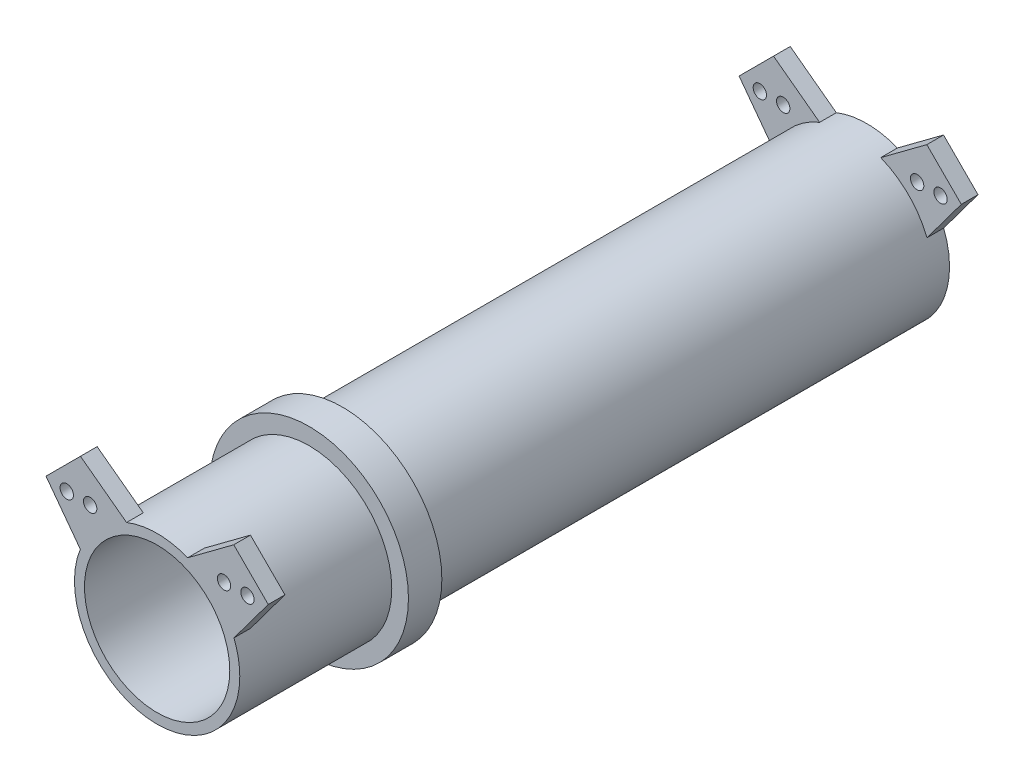
ISO-10303-21;
HEADER;
FILE_DESCRIPTION(('STEP AP214'),'2;1');
FILE_NAME('part.step','',(''),(''),'','','');
FILE_SCHEMA(('AUTOMOTIVE_DESIGN { 1 0 10303 214 1 1 1 1 }'));
ENDSEC;
DATA;
#1=APPLICATION_CONTEXT('core data for automotive mechanical design processes');
#2=APPLICATION_PROTOCOL_DEFINITION('international standard','automotive_design',2000,#1);
#3=PRODUCT_CONTEXT('',#1,'mechanical');
#4=PRODUCT('Part','Part','',(#3));
#5=PRODUCT_RELATED_PRODUCT_CATEGORY('part','',(#4));
#6=PRODUCT_DEFINITION_FORMATION('','',#4);
#7=PRODUCT_DEFINITION_CONTEXT('part definition',#1,'design');
#8=PRODUCT_DEFINITION('design','',#6,#7);
#9=PRODUCT_DEFINITION_SHAPE('','',#8);
#10=(LENGTH_UNIT() NAMED_UNIT(*) SI_UNIT(.MILLI.,.METRE.));
#11=(NAMED_UNIT(*) PLANE_ANGLE_UNIT() SI_UNIT($,.RADIAN.));
#12=(NAMED_UNIT(*) SI_UNIT($,.STERADIAN.) SOLID_ANGLE_UNIT());
#13=UNCERTAINTY_MEASURE_WITH_UNIT(LENGTH_MEASURE(1.E-05),#10,'distance_accuracy_value','');
#14=(GEOMETRIC_REPRESENTATION_CONTEXT(3) GLOBAL_UNCERTAINTY_ASSIGNED_CONTEXT((#13)) GLOBAL_UNIT_ASSIGNED_CONTEXT((#10,
#11,#12)) REPRESENTATION_CONTEXT('',''));
#15=CARTESIAN_POINT('',(0.,0.,0.));
#16=DIRECTION('',(0.,0.,1.));
#17=DIRECTION('',(1.,0.,0.));
#18=AXIS2_PLACEMENT_3D('',#15,#16,#17);
#19=CARTESIAN_POINT('',(0.,0.,-90.));
#20=DIRECTION('',(0.,0.,1.));
#21=DIRECTION('',(1.,0.,0.));
#22=AXIS2_PLACEMENT_3D('',#19,#20,#21);
#23=CYLINDRICAL_SURFACE('',#22,24.75);
#24=CARTESIAN_POINT('',(0.,0.,67.));
#25=DIRECTION('',(0.,0.,-1.));
#26=DIRECTION('',(0.,1.,0.));
#27=AXIS2_PLACEMENT_3D('',#24,#25,#26);
#28=CIRCLE('',#27,24.75);
#29=CARTESIAN_POINT('',(0.,24.75,67.));
#30=VERTEX_POINT('',#29);
#31=EDGE_CURVE('E11',#30,#30,#28,.F.);
#32=ORIENTED_EDGE('',*,*,#31,.F.);
#33=EDGE_LOOP('',(#32));
#34=FACE_BOUND('',#33,.T.);
#35=CARTESIAN_POINT('',(0.,0.,-85.));
#36=DIRECTION('',(0.,0.,-1.));
#37=DIRECTION('',(-1.,0.,0.));
#38=AXIS2_PLACEMENT_3D('',#35,#36,#37);
#39=CIRCLE('',#38,24.75);
#40=CARTESIAN_POINT('',(9.14712231360462,22.9976662594263,-85.));
#41=VERTEX_POINT('',#40);
#42=CARTESIAN_POINT('',(22.9976662594264,9.14712231360438,-85.));
#43=VERTEX_POINT('',#42);
#44=EDGE_CURVE('E62',#41,#43,#39,.T.);
#45=ORIENTED_EDGE('',*,*,#44,.F.);
#46=DIRECTION('',(0.,0.,-1.));
#47=VECTOR('',#46,1.);
#48=CARTESIAN_POINT('',(9.14712231360463,22.9976662594263,-85.));
#49=LINE('',#48,#47);
#50=CARTESIAN_POINT('',(9.14712231360463,22.9976662594263,-90.));
#51=VERTEX_POINT('',#50);
#52=EDGE_CURVE('E181',#41,#51,#49,.T.);
#53=ORIENTED_EDGE('',*,*,#52,.T.);
#54=CARTESIAN_POINT('',(0.,0.,-90.));
#55=DIRECTION('',(0.,0.,1.));
#56=DIRECTION('',(1.,0.,0.));
#57=AXIS2_PLACEMENT_3D('',#54,#55,#56);
#58=CIRCLE('',#57,24.75);
#59=CARTESIAN_POINT('',(-9.14712231360462,22.9976662594263,-90.));
#60=VERTEX_POINT('',#59);
#61=EDGE_CURVE('E344',#51,#60,#58,.T.);
#62=ORIENTED_EDGE('',*,*,#61,.T.);
#63=DIRECTION('',(0.,0.,-1.));
#64=VECTOR('',#63,1.);
#65=CARTESIAN_POINT('',(-9.14712231360463,22.9976662594263,-85.));
#66=LINE('',#65,#64);
#67=CARTESIAN_POINT('',(-9.14712231360462,22.9976662594263,-85.));
#68=VERTEX_POINT('',#67);
#69=EDGE_CURVE('E224',#68,#60,#66,.T.);
#70=ORIENTED_EDGE('',*,*,#69,.F.);
#71=CARTESIAN_POINT('',(0.,0.,-85.));
#72=DIRECTION('',(0.,0.,1.));
#73=DIRECTION('',(1.,0.,0.));
#74=AXIS2_PLACEMENT_3D('',#71,#72,#73);
#75=CIRCLE('',#74,24.75);
#76=CARTESIAN_POINT('',(-22.9976662594264,9.14712231360437,-85.));
#77=VERTEX_POINT('',#76);
#78=EDGE_CURVE('E216',#68,#77,#75,.T.);
#79=ORIENTED_EDGE('',*,*,#78,.T.);
#80=DIRECTION('',(0.,0.,-1.));
#81=VECTOR('',#80,1.);
#82=CARTESIAN_POINT('',(-22.9976662594264,9.14712231360438,-85.));
#83=LINE('',#82,#81);
#84=CARTESIAN_POINT('',(-22.9976662594264,9.14712231360438,-90.));
#85=VERTEX_POINT('',#84);
#86=EDGE_CURVE('E243',#77,#85,#83,.T.);
#87=ORIENTED_EDGE('',*,*,#86,.T.);
#88=CARTESIAN_POINT('',(22.9976662594264,9.14712231360437,-90.));
#89=VERTEX_POINT('',#88);
#90=EDGE_CURVE('E49',#85,#89,#58,.T.);
#91=ORIENTED_EDGE('',*,*,#90,.T.);
#92=DIRECTION('',(0.,0.,-1.));
#93=VECTOR('',#92,1.);
#94=CARTESIAN_POINT('',(22.9976662594264,9.14712231360438,-85.));
#95=LINE('',#94,#93);
#96=EDGE_CURVE('E67',#43,#89,#95,.T.);
#97=ORIENTED_EDGE('',*,*,#96,.F.);
#98=EDGE_LOOP('',(#45,#53,#62,#70,#79,#87,#91,#97));
#99=FACE_BOUND('',#98,.T.);
#100=ADVANCED_FACE('F45',(#34,#99),#23,.T.);
#101=DIRECTION('',(0.,0.,1.));
#102=VECTOR('',#101,1.);
#103=CARTESIAN_POINT('',(9.14712231360463,22.9976662594263,117.5));
#104=LINE('',#103,#102);
#105=CARTESIAN_POINT('',(9.14712231360463,22.9976662594263,117.5));
#106=VERTEX_POINT('',#105);
#107=CARTESIAN_POINT('',(9.14712231360463,22.9976662594263,122.5));
#108=VERTEX_POINT('',#107);
#109=EDGE_CURVE('E270',#106,#108,#104,.T.);
#110=ORIENTED_EDGE('',*,*,#109,.F.);
#111=CARTESIAN_POINT('',(0.,0.,117.5));
#112=DIRECTION('',(0.,0.,-1.));
#113=DIRECTION('',(-1.,0.,0.));
#114=AXIS2_PLACEMENT_3D('',#111,#112,#113);
#115=CIRCLE('',#114,24.75);
#116=CARTESIAN_POINT('',(22.9976662594264,9.14712231360438,117.5));
#117=VERTEX_POINT('',#116);
#118=EDGE_CURVE('E261',#106,#117,#115,.T.);
#119=ORIENTED_EDGE('',*,*,#118,.T.);
#120=DIRECTION('',(0.,0.,1.));
#121=VECTOR('',#120,1.);
#122=CARTESIAN_POINT('',(22.9976662594264,9.14712231360438,117.5));
#123=LINE('',#122,#121);
#124=CARTESIAN_POINT('',(22.9976662594264,9.14712231360438,122.5));
#125=VERTEX_POINT('',#124);
#126=EDGE_CURVE('E288',#117,#125,#123,.T.);
#127=ORIENTED_EDGE('',*,*,#126,.T.);
#128=CARTESIAN_POINT('',(0.,0.,122.5));
#129=DIRECTION('',(0.,0.,1.));
#130=DIRECTION('',(1.,0.,0.));
#131=AXIS2_PLACEMENT_3D('',#128,#129,#130);
#132=CIRCLE('',#131,24.75);
#133=CARTESIAN_POINT('',(-22.9976662594264,9.14712231360438,122.5));
#134=VERTEX_POINT('',#133);
#135=EDGE_CURVE('E335',#134,#125,#132,.T.);
#136=ORIENTED_EDGE('',*,*,#135,.F.);
#137=DIRECTION('',(0.,0.,1.));
#138=VECTOR('',#137,1.);
#139=CARTESIAN_POINT('',(-22.9976662594264,9.14712231360438,117.5));
#140=LINE('',#139,#138);
#141=CARTESIAN_POINT('',(-22.9976662594264,9.14712231360438,117.5));
#142=VERTEX_POINT('',#141);
#143=EDGE_CURVE('E324',#142,#134,#140,.T.);
#144=ORIENTED_EDGE('',*,*,#143,.F.);
#145=CARTESIAN_POINT('',(0.,0.,117.5));
#146=DIRECTION('',(0.,0.,1.));
#147=DIRECTION('',(1.,0.,0.));
#148=AXIS2_PLACEMENT_3D('',#145,#146,#147);
#149=CIRCLE('',#148,24.75);
#150=CARTESIAN_POINT('',(-9.14712231360463,22.9976662594263,117.5));
#151=VERTEX_POINT('',#150);
#152=EDGE_CURVE('E306',#151,#142,#149,.T.);
#153=ORIENTED_EDGE('',*,*,#152,.F.);
#154=DIRECTION('',(0.,0.,1.));
#155=VECTOR('',#154,1.);
#156=CARTESIAN_POINT('',(-9.14712231360463,22.9976662594263,117.5));
#157=LINE('',#156,#155);
#158=CARTESIAN_POINT('',(-9.14712231360463,22.9976662594263,122.5));
#159=VERTEX_POINT('',#158);
#160=EDGE_CURVE('E320',#151,#159,#157,.T.);
#161=ORIENTED_EDGE('',*,*,#160,.T.);
#162=EDGE_CURVE('E334',#108,#159,#132,.T.);
#163=ORIENTED_EDGE('',*,*,#162,.F.);
#164=EDGE_LOOP('',(#110,#119,#127,#136,#144,#153,#161,#163));
#165=FACE_BOUND('',#164,.T.);
#166=CARTESIAN_POINT('',(0.,0.,77.));
#167=DIRECTION('',(0.,0.,1.));
#168=DIRECTION('',(1.,0.,0.));
#169=AXIS2_PLACEMENT_3D('',#166,#167,#168);
#170=CIRCLE('',#169,24.75);
#171=CARTESIAN_POINT('',(24.75,0.,77.));
#172=VERTEX_POINT('',#171);
#173=EDGE_CURVE('E54',#172,#172,#170,.F.);
#174=ORIENTED_EDGE('',*,*,#173,.F.);
#175=EDGE_LOOP('',(#174));
#176=FACE_BOUND('',#175,.T.);
#177=ADVANCED_FACE('F47',(#165,#176),#23,.T.);
#178=CARTESIAN_POINT('',(0.,0.,-90.));
#179=DIRECTION('',(0.,0.,1.));
#180=DIRECTION('',(1.,0.,0.));
#181=AXIS2_PLACEMENT_3D('',#178,#179,#180);
#182=PLANE('',#181);
#183=CARTESIAN_POINT('',(0.,0.,-90.));
#184=DIRECTION('',(0.,0.,1.));
#185=DIRECTION('',(1.,0.,0.));
#186=AXIS2_PLACEMENT_3D('',#183,#184,#185);
#187=CIRCLE('',#186,21.75);
#188=CARTESIAN_POINT('',(21.75,0.,-90.));
#189=VERTEX_POINT('',#188);
#190=EDGE_CURVE('E341',#189,#189,#187,.T.);
#191=ORIENTED_EDGE('',*,*,#190,.T.);
#192=EDGE_LOOP('',(#191));
#193=FACE_BOUND('',#192,.T.);
#194=ORIENTED_EDGE('',*,*,#90,.F.);
#195=DIRECTION('',(-0.596996927943198,0.802243521648124,0.));
#196=VECTOR('',#195,1.);
#197=CARTESIAN_POINT('',(-10.4202808132108,-7.75434823208315,-90.));
#198=LINE('',#197,#196);
#199=CARTESIAN_POINT('',(-33.2674063718993,22.9475827324311,-90.));
#200=VERTEX_POINT('',#199);
#201=EDGE_CURVE('E233',#85,#200,#198,.T.);
#202=ORIENTED_EDGE('',*,*,#201,.T.);
#203=DIRECTION('',(0.707106781186544,0.707106781186552,0.));
#204=VECTOR('',#203,1.);
#205=CARTESIAN_POINT('',(-28.1074945521654,28.1074945521651,-90.));
#206=LINE('',#205,#204);
#207=CARTESIAN_POINT('',(-22.9475827324315,33.2674063718991,-90.));
#208=VERTEX_POINT('',#207);
#209=EDGE_CURVE('E210',#200,#208,#206,.T.);
#210=ORIENTED_EDGE('',*,*,#209,.T.);
#211=DIRECTION('',(0.802243521648131,-0.596996927943189,0.));
#212=VECTOR('',#211,1.);
#213=CARTESIAN_POINT('',(7.75434823208304,10.4202808132109,-90.));
#214=LINE('',#213,#212);
#215=EDGE_CURVE('E230',#208,#60,#214,.T.);
#216=ORIENTED_EDGE('',*,*,#215,.T.);
#217=ORIENTED_EDGE('',*,*,#61,.F.);
#218=DIRECTION('',(-0.802243521648131,-0.596996927943189,0.));
#219=VECTOR('',#218,1.);
#220=CARTESIAN_POINT('',(-7.75434823208304,10.4202808132109,-90.));
#221=LINE('',#220,#219);
#222=CARTESIAN_POINT('',(22.9475827324315,33.2674063718991,-90.));
#223=VERTEX_POINT('',#222);
#224=EDGE_CURVE('E197',#223,#51,#221,.T.);
#225=ORIENTED_EDGE('',*,*,#224,.F.);
#226=DIRECTION('',(-0.707106781186544,0.707106781186552,0.));
#227=VECTOR('',#226,1.);
#228=CARTESIAN_POINT('',(28.1074945521654,28.1074945521651,-90.));
#229=LINE('',#228,#227);
#230=CARTESIAN_POINT('',(33.2674063718993,22.9475827324311,-90.));
#231=VERTEX_POINT('',#230);
#232=EDGE_CURVE('E174',#231,#223,#229,.T.);
#233=ORIENTED_EDGE('',*,*,#232,.F.);
#234=DIRECTION('',(0.596996927943198,0.802243521648124,0.));
#235=VECTOR('',#234,1.);
#236=CARTESIAN_POINT('',(10.4202808132108,-7.75434823208315,-90.));
#237=LINE('',#236,#235);
#238=EDGE_CURVE('E200',#89,#231,#237,.T.);
#239=ORIENTED_EDGE('',*,*,#238,.F.);
#240=EDGE_LOOP('',(#194,#202,#210,#216,#217,#225,#233,#239));
#241=FACE_BOUND('',#240,.T.);
#242=CARTESIAN_POINT('',(-27.0468343803856,22.0970869120794,-90.));
#243=DIRECTION('',(0.,0.,1.));
#244=DIRECTION('',(1.,0.,0.));
#245=AXIS2_PLACEMENT_3D('',#242,#243,#244);
#246=CIRCLE('',#245,2.0000000000001);
#247=CARTESIAN_POINT('',(-25.0468343803855,22.0970869120794,-90.));
#248=VERTEX_POINT('',#247);
#249=EDGE_CURVE('E203',#248,#248,#246,.T.);
#250=ORIENTED_EDGE('',*,*,#249,.T.);
#251=EDGE_LOOP('',(#250));
#252=FACE_BOUND('',#251,.T.);
#253=CARTESIAN_POINT('',(-20.0468343803856,22.0970869120794,-90.));
#254=DIRECTION('',(0.,0.,1.));
#255=DIRECTION('',(1.,0.,0.));
#256=AXIS2_PLACEMENT_3D('',#253,#254,#255);
#257=CIRCLE('',#256,2.00000000000001);
#258=CARTESIAN_POINT('',(-18.0468343803856,22.0970869120794,-90.));
#259=VERTEX_POINT('',#258);
#260=EDGE_CURVE('E227',#259,#259,#257,.T.);
#261=ORIENTED_EDGE('',*,*,#260,.T.);
#262=EDGE_LOOP('',(#261));
#263=FACE_BOUND('',#262,.T.);
#264=CARTESIAN_POINT('',(27.0468343803856,22.0970869120794,-90.));
#265=DIRECTION('',(0.,0.,-1.));
#266=DIRECTION('',(-1.,0.,0.));
#267=AXIS2_PLACEMENT_3D('',#264,#265,#266);
#268=CIRCLE('',#267,2.0000000000001);
#269=CARTESIAN_POINT('',(25.0468343803855,22.0970869120794,-90.));
#270=VERTEX_POINT('',#269);
#271=EDGE_CURVE('E191',#270,#270,#268,.T.);
#272=ORIENTED_EDGE('',*,*,#271,.F.);
#273=EDGE_LOOP('',(#272));
#274=FACE_BOUND('',#273,.T.);
#275=CARTESIAN_POINT('',(20.0468343803856,22.0970869120794,-90.));
#276=DIRECTION('',(0.,0.,-1.));
#277=DIRECTION('',(-1.,0.,0.));
#278=AXIS2_PLACEMENT_3D('',#275,#276,#277);
#279=CIRCLE('',#278,2.00000000000001);
#280=CARTESIAN_POINT('',(18.0468343803856,22.0970869120794,-90.));
#281=VERTEX_POINT('',#280);
#282=EDGE_CURVE('E194',#281,#281,#279,.T.);
#283=ORIENTED_EDGE('',*,*,#282,.F.);
#284=EDGE_LOOP('',(#283));
#285=FACE_BOUND('',#284,.T.);
#286=ADVANCED_FACE('F353',(#193,#241,#252,#263,#274,#285),#182,.F.);
#287=CARTESIAN_POINT('',(0.,0.,-90.));
#288=DIRECTION('',(0.,0.,1.));
#289=DIRECTION('',(1.,0.,0.));
#290=AXIS2_PLACEMENT_3D('',#287,#288,#289);
#291=CYLINDRICAL_SURFACE('',#290,21.75);
#292=CARTESIAN_POINT('',(0.,0.,122.5));
#293=DIRECTION('',(0.,0.,1.));
#294=DIRECTION('',(1.,0.,0.));
#295=AXIS2_PLACEMENT_3D('',#292,#293,#294);
#296=CIRCLE('',#295,21.75);
#297=CARTESIAN_POINT('',(21.75,0.,122.5));
#298=VERTEX_POINT('',#297);
#299=EDGE_CURVE('E323',#298,#298,#296,.T.);
#300=CARTESIAN_POINT('',(21.75,0.,-90.));
#301=CARTESIAN_POINT('',(21.75,0.,-87.7864583333333));
#302=CARTESIAN_POINT('',(21.75,0.,-85.5729166666667));
#303=CARTESIAN_POINT('',(21.75,0.,-81.1458333333333));
#304=CARTESIAN_POINT('',(21.75,0.,-78.9322916666667));
#305=CARTESIAN_POINT('',(21.75,0.,-74.5052083333333));
#306=CARTESIAN_POINT('',(21.75,0.,-72.2916666666667));
#307=CARTESIAN_POINT('',(21.75,0.,-67.8645833333333));
#308=CARTESIAN_POINT('',(21.75,0.,-65.6510416666667));
#309=CARTESIAN_POINT('',(21.75,0.,-61.2239583333333));
#310=CARTESIAN_POINT('',(21.75,0.,-59.0104166666667));
#311=CARTESIAN_POINT('',(21.75,0.,-54.5833333333333));
#312=CARTESIAN_POINT('',(21.75,0.,-52.3697916666667));
#313=CARTESIAN_POINT('',(21.75,0.,-47.9427083333333));
#314=CARTESIAN_POINT('',(21.75,0.,-45.7291666666667));
#315=CARTESIAN_POINT('',(21.75,0.,-41.3020833333333));
#316=CARTESIAN_POINT('',(21.75,0.,-39.0885416666667));
#317=CARTESIAN_POINT('',(21.75,0.,-34.6614583333333));
#318=CARTESIAN_POINT('',(21.75,0.,-32.4479166666667));
#319=CARTESIAN_POINT('',(21.75,0.,-28.0208333333333));
#320=CARTESIAN_POINT('',(21.75,0.,-25.8072916666667));
#321=CARTESIAN_POINT('',(21.75,0.,-21.3802083333333));
#322=CARTESIAN_POINT('',(21.75,0.,-19.1666666666667));
#323=CARTESIAN_POINT('',(21.75,0.,-14.7395833333333));
#324=CARTESIAN_POINT('',(21.75,0.,-12.5260416666667));
#325=CARTESIAN_POINT('',(21.75,0.,-8.09895833333334));
#326=CARTESIAN_POINT('',(21.75,0.,-5.88541666666667));
#327=CARTESIAN_POINT('',(21.75,0.,-1.45833333333333));
#328=CARTESIAN_POINT('',(21.75,0.,0.755208333333336));
#329=CARTESIAN_POINT('',(21.75,0.,5.18229166666667));
#330=CARTESIAN_POINT('',(21.75,0.,7.39583333333334));
#331=CARTESIAN_POINT('',(21.75,0.,11.8229166666667));
#332=CARTESIAN_POINT('',(21.75,0.,14.0364583333333));
#333=CARTESIAN_POINT('',(21.75,0.,18.4635416666667));
#334=CARTESIAN_POINT('',(21.75,0.,20.6770833333333));
#335=CARTESIAN_POINT('',(21.75,0.,25.1041666666667));
#336=CARTESIAN_POINT('',(21.75,0.,27.3177083333333));
#337=CARTESIAN_POINT('',(21.75,0.,31.7447916666667));
#338=CARTESIAN_POINT('',(21.75,0.,33.9583333333333));
#339=CARTESIAN_POINT('',(21.75,0.,38.3854166666667));
#340=CARTESIAN_POINT('',(21.75,0.,40.5989583333333));
#341=CARTESIAN_POINT('',(21.75,0.,45.0260416666667));
#342=CARTESIAN_POINT('',(21.75,0.,47.2395833333333));
#343=CARTESIAN_POINT('',(21.75,0.,51.6666666666667));
#344=CARTESIAN_POINT('',(21.75,0.,53.8802083333333));
#345=CARTESIAN_POINT('',(21.75,0.,58.3072916666667));
#346=CARTESIAN_POINT('',(21.75,0.,60.5208333333333));
#347=CARTESIAN_POINT('',(21.75,0.,64.9479166666666));
#348=CARTESIAN_POINT('',(21.75,0.,67.1614583333333));
#349=CARTESIAN_POINT('',(21.75,0.,71.5885416666667));
#350=CARTESIAN_POINT('',(21.75,0.,73.8020833333333));
#351=CARTESIAN_POINT('',(21.75,0.,78.2291666666667));
#352=CARTESIAN_POINT('',(21.75,0.,80.4427083333333));
#353=CARTESIAN_POINT('',(21.75,0.,84.8697916666667));
#354=CARTESIAN_POINT('',(21.75,0.,87.0833333333333));
#355=CARTESIAN_POINT('',(21.75,0.,91.5104166666667));
#356=CARTESIAN_POINT('',(21.75,0.,93.7239583333333));
#357=CARTESIAN_POINT('',(21.75,0.,98.1510416666667));
#358=CARTESIAN_POINT('',(21.75,0.,100.364583333333));
#359=CARTESIAN_POINT('',(21.75,0.,104.791666666667));
#360=CARTESIAN_POINT('',(21.75,0.,107.005208333333));
#361=CARTESIAN_POINT('',(21.75,0.,111.432291666667));
#362=CARTESIAN_POINT('',(21.75,0.,113.645833333333));
#363=CARTESIAN_POINT('',(21.75,0.,118.072916666667));
#364=CARTESIAN_POINT('',(21.75,0.,120.286458333333));
#365=CARTESIAN_POINT('',(21.75,0.,122.5));
#366=B_SPLINE_CURVE_WITH_KNOTS('',3,(#300,#301,#302,#303,#304,#305,#306,#307,#308,#309,#310,
#311,#312,#313,#314,#315,#316,#317,#318,#319,#320,#321,#322,#323,#324,#325,#326,#327,#328,#329,
#330,#331,#332,#333,#334,#335,#336,#337,#338,#339,#340,#341,#342,#343,#344,#345,#346,#347,#348,
#349,#350,#351,#352,#353,#354,#355,#356,#357,#358,#359,#360,#361,#362,#363,#364,#365),
.UNSPECIFIED.,.F.,.F.,(4,2,2,2,2,2,2,2,2,2,2,2,2,2,2,2,2,2,2,2,2,2,2,2,2,2,2,2,2,2,2,2,4),(0.,
6.640625,13.28125,19.921875,26.5625,33.203125,39.84375,46.484375,53.125,59.765625,66.40625,
73.046875,79.6875,86.328125,92.96875,99.609375,106.25,112.890625,119.53125,126.171875,132.8125,
139.453125,146.09375,152.734375,159.375,166.015625,172.65625,179.296875,185.9375,192.578125,
199.21875,205.859375,212.5),.UNSPECIFIED.);
#367=EDGE_CURVE('BSEAM410',#189,#298,#366,.T.);
#368=ORIENTED_EDGE('',*,*,#190,.F.);
#369=ORIENTED_EDGE('',*,*,#299,.T.);
#370=ORIENTED_EDGE('',*,*,#367,.T.);
#371=ORIENTED_EDGE('',*,*,#367,.F.);
#372=EDGE_LOOP('',(#368,#370,#369,#371));
#373=FACE_BOUND('',#372,.T.);
#374=ADVANCED_FACE('F410',(#373),#291,.F.);
#375=CARTESIAN_POINT('',(0.,0.,77.));
#376=DIRECTION('',(0.,0.,1.));
#377=DIRECTION('',(1.,0.,0.));
#378=AXIS2_PLACEMENT_3D('',#375,#376,#377);
#379=PLANE('',#378);
#380=ORIENTED_EDGE('',*,*,#173,.T.);
#381=EDGE_LOOP('',(#380));
#382=FACE_BOUND('',#381,.T.);
#383=CARTESIAN_POINT('',(0.,0.,77.));
#384=DIRECTION('',(0.,0.,1.));
#385=DIRECTION('',(1.,0.,0.));
#386=AXIS2_PLACEMENT_3D('',#383,#384,#385);
#387=CIRCLE('',#386,29.75);
#388=CARTESIAN_POINT('',(29.75,0.,77.));
#389=VERTEX_POINT('',#388);
#390=EDGE_CURVE('E338',#389,#389,#387,.T.);
#391=ORIENTED_EDGE('',*,*,#390,.T.);
#392=EDGE_LOOP('',(#391));
#393=FACE_BOUND('',#392,.T.);
#394=ADVANCED_FACE('F399',(#382,#393),#379,.T.);
#395=CARTESIAN_POINT('',(0.,0.,77.));
#396=DIRECTION('',(0.,0.,-1.));
#397=DIRECTION('',(-1.,0.,0.));
#398=AXIS2_PLACEMENT_3D('',#395,#396,#397);
#399=CYLINDRICAL_SURFACE('',#398,29.75);
#400=ORIENTED_EDGE('',*,*,#390,.F.);
#401=EDGE_LOOP('',(#400));
#402=FACE_BOUND('',#401,.T.);
#403=CARTESIAN_POINT('',(0.,0.,67.));
#404=DIRECTION('',(0.,0.,1.));
#405=DIRECTION('',(1.,0.,0.));
#406=AXIS2_PLACEMENT_3D('',#403,#404,#405);
#407=CIRCLE('',#406,29.75);
#408=CARTESIAN_POINT('',(29.75,0.,67.));
#409=VERTEX_POINT('',#408);
#410=EDGE_CURVE('E240',#409,#409,#407,.T.);
#411=ORIENTED_EDGE('',*,*,#410,.T.);
#412=EDGE_LOOP('',(#411));
#413=FACE_BOUND('',#412,.T.);
#414=ADVANCED_FACE('F396',(#402,#413),#399,.T.);
#415=CARTESIAN_POINT('',(0.,0.,122.5));
#416=DIRECTION('',(0.,0.,1.));
#417=DIRECTION('',(1.,0.,0.));
#418=AXIS2_PLACEMENT_3D('',#415,#416,#417);
#419=PLANE('',#418);
#420=ORIENTED_EDGE('',*,*,#135,.T.);
#421=DIRECTION('',(0.596996927943198,0.802243521648124,0.));
#422=VECTOR('',#421,1.);
#423=CARTESIAN_POINT('',(10.4202808132108,-7.75434823208315,122.5));
#424=LINE('',#423,#422);
#425=CARTESIAN_POINT('',(33.2674063718993,22.9475827324311,122.5));
#426=VERTEX_POINT('',#425);
#427=EDGE_CURVE('E278',#125,#426,#424,.T.);
#428=ORIENTED_EDGE('',*,*,#427,.T.);
#429=DIRECTION('',(-0.707106781186544,0.707106781186552,0.));
#430=VECTOR('',#429,1.);
#431=CARTESIAN_POINT('',(28.1074945521654,28.1074945521651,122.5));
#432=LINE('',#431,#430);
#433=CARTESIAN_POINT('',(22.9475827324315,33.2674063718991,122.5));
#434=VERTEX_POINT('',#433);
#435=EDGE_CURVE('E255',#426,#434,#432,.T.);
#436=ORIENTED_EDGE('',*,*,#435,.T.);
#437=DIRECTION('',(-0.802243521648131,-0.596996927943189,0.));
#438=VECTOR('',#437,1.);
#439=CARTESIAN_POINT('',(-7.75434823208304,10.4202808132109,122.5));
#440=LINE('',#439,#438);
#441=EDGE_CURVE('E276',#434,#108,#440,.T.);
#442=ORIENTED_EDGE('',*,*,#441,.T.);
#443=ORIENTED_EDGE('',*,*,#162,.T.);
#444=DIRECTION('',(0.802243521648131,-0.596996927943189,0.));
#445=VECTOR('',#444,1.);
#446=CARTESIAN_POINT('',(7.75434823208304,10.4202808132109,122.5));
#447=LINE('',#446,#445);
#448=CARTESIAN_POINT('',(-22.9475827324315,33.2674063718991,122.5));
#449=VERTEX_POINT('',#448);
#450=EDGE_CURVE('E314',#449,#159,#447,.T.);
#451=ORIENTED_EDGE('',*,*,#450,.F.);
#452=DIRECTION('',(0.707106781186544,0.707106781186552,0.));
#453=VECTOR('',#452,1.);
#454=CARTESIAN_POINT('',(-28.1074945521654,28.1074945521651,122.5));
#455=LINE('',#454,#453);
#456=CARTESIAN_POINT('',(-33.2674063718993,22.9475827324311,122.5));
#457=VERTEX_POINT('',#456);
#458=EDGE_CURVE('E317',#457,#449,#455,.T.);
#459=ORIENTED_EDGE('',*,*,#458,.F.);
#460=DIRECTION('',(-0.596996927943198,0.802243521648124,0.));
#461=VECTOR('',#460,1.);
#462=CARTESIAN_POINT('',(-10.4202808132108,-7.75434823208315,122.5));
#463=LINE('',#462,#461);
#464=EDGE_CURVE('E297',#134,#457,#463,.T.);
#465=ORIENTED_EDGE('',*,*,#464,.F.);
#466=EDGE_LOOP('',(#420,#428,#436,#442,#443,#451,#459,#465));
#467=FACE_BOUND('',#466,.T.);
#468=ORIENTED_EDGE('',*,*,#299,.F.);
#469=EDGE_LOOP('',(#468));
#470=FACE_BOUND('',#469,.T.);
#471=CARTESIAN_POINT('',(-27.0468343803856,22.0970869120794,122.5));
#472=DIRECTION('',(0.,0.,1.));
#473=DIRECTION('',(1.,0.,0.));
#474=AXIS2_PLACEMENT_3D('',#471,#472,#473);
#475=CIRCLE('',#474,2.0000000000001);
#476=CARTESIAN_POINT('',(-25.0468343803855,22.0970869120794,122.5));
#477=VERTEX_POINT('',#476);
#478=EDGE_CURVE('E285',#477,#477,#475,.T.);
#479=ORIENTED_EDGE('',*,*,#478,.F.);
#480=EDGE_LOOP('',(#479));
#481=FACE_BOUND('',#480,.T.);
#482=CARTESIAN_POINT('',(-20.0468343803856,22.0970869120794,122.5));
#483=DIRECTION('',(0.,0.,1.));
#484=DIRECTION('',(1.,0.,0.));
#485=AXIS2_PLACEMENT_3D('',#482,#483,#484);
#486=CIRCLE('',#485,2.00000000000001);
#487=CARTESIAN_POINT('',(-18.0468343803856,22.0970869120794,122.5));
#488=VERTEX_POINT('',#487);
#489=EDGE_CURVE('E311',#488,#488,#486,.T.);
#490=ORIENTED_EDGE('',*,*,#489,.F.);
#491=EDGE_LOOP('',(#490));
#492=FACE_BOUND('',#491,.T.);
#493=CARTESIAN_POINT('',(27.0468343803856,22.0970869120794,122.5));
#494=DIRECTION('',(0.,0.,-1.));
#495=DIRECTION('',(-1.,0.,0.));
#496=AXIS2_PLACEMENT_3D('',#493,#494,#495);
#497=CIRCLE('',#496,2.0000000000001);
#498=CARTESIAN_POINT('',(25.0468343803855,22.0970869120794,122.5));
#499=VERTEX_POINT('',#498);
#500=EDGE_CURVE('E249',#499,#499,#497,.T.);
#501=ORIENTED_EDGE('',*,*,#500,.T.);
#502=EDGE_LOOP('',(#501));
#503=FACE_BOUND('',#502,.T.);
#504=CARTESIAN_POINT('',(20.0468343803856,22.0970869120794,122.5));
#505=DIRECTION('',(0.,0.,-1.));
#506=DIRECTION('',(-1.,0.,0.));
#507=AXIS2_PLACEMENT_3D('',#504,#505,#506);
#508=CIRCLE('',#507,2.00000000000001);
#509=CARTESIAN_POINT('',(18.0468343803856,22.0970869120794,122.5));
#510=VERTEX_POINT('',#509);
#511=EDGE_CURVE('E273',#510,#510,#508,.T.);
#512=ORIENTED_EDGE('',*,*,#511,.T.);
#513=EDGE_LOOP('',(#512));
#514=FACE_BOUND('',#513,.T.);
#515=ADVANCED_FACE('F398',(#467,#470,#481,#492,#503,#514),#419,.T.);
#516=CARTESIAN_POINT('',(7.75434823208304,10.4202808132109,117.5));
#517=DIRECTION('',(-0.596996927943189,-0.802243521648131,0.));
#518=DIRECTION('',(0.802243521648131,-0.596996927943189,0.));
#519=AXIS2_PLACEMENT_3D('',#516,#517,#518);
#520=PLANE('',#519);
#521=ORIENTED_EDGE('',*,*,#450,.T.);
#522=ORIENTED_EDGE('',*,*,#160,.F.);
#523=DIRECTION('',(0.802243521648131,-0.596996927943189,0.));
#524=VECTOR('',#523,1.);
#525=CARTESIAN_POINT('',(7.75434823208304,10.4202808132109,117.5));
#526=LINE('',#525,#524);
#527=CARTESIAN_POINT('',(-22.9475827324315,33.2674063718991,117.5));
#528=VERTEX_POINT('',#527);
#529=EDGE_CURVE('E300',#528,#151,#526,.T.);
#530=ORIENTED_EDGE('',*,*,#529,.F.);
#531=DIRECTION('',(0.,0.,1.));
#532=VECTOR('',#531,1.);
#533=CARTESIAN_POINT('',(-22.9475827324315,33.2674063718991,117.5));
#534=LINE('',#533,#532);
#535=EDGE_CURVE('E308',#528,#449,#534,.T.);
#536=ORIENTED_EDGE('',*,*,#535,.T.);
#537=EDGE_LOOP('',(#521,#522,#530,#536));
#538=FACE_BOUND('',#537,.T.);
#539=ADVANCED_FACE('F406',(#538),#520,.F.);
#540=CARTESIAN_POINT('',(-10.4202808132108,-7.75434823208315,117.5));
#541=DIRECTION('',(0.802243521648124,0.596996927943198,0.));
#542=DIRECTION('',(-0.596996927943198,0.802243521648124,0.));
#543=AXIS2_PLACEMENT_3D('',#540,#541,#542);
#544=PLANE('',#543);
#545=ORIENTED_EDGE('',*,*,#464,.T.);
#546=DIRECTION('',(0.,0.,1.));
#547=VECTOR('',#546,1.);
#548=CARTESIAN_POINT('',(-33.2674063718993,22.9475827324311,117.5));
#549=LINE('',#548,#547);
#550=CARTESIAN_POINT('',(-33.2674063718993,22.9475827324311,117.5));
#551=VERTEX_POINT('',#550);
#552=EDGE_CURVE('E327',#551,#457,#549,.T.);
#553=ORIENTED_EDGE('',*,*,#552,.F.);
#554=DIRECTION('',(-0.596996927943198,0.802243521648124,0.));
#555=VECTOR('',#554,1.);
#556=CARTESIAN_POINT('',(-10.4202808132108,-7.75434823208315,117.5));
#557=LINE('',#556,#555);
#558=EDGE_CURVE('E304',#142,#551,#557,.T.);
#559=ORIENTED_EDGE('',*,*,#558,.F.);
#560=ORIENTED_EDGE('',*,*,#143,.T.);
#561=EDGE_LOOP('',(#545,#553,#559,#560));
#562=FACE_BOUND('',#561,.T.);
#563=ADVANCED_FACE('F460',(#562),#544,.F.);
#564=CARTESIAN_POINT('',(-20.0468343803856,22.0970869120794,117.5));
#565=DIRECTION('',(0.,0.,1.));
#566=DIRECTION('',(1.,0.,0.));
#567=AXIS2_PLACEMENT_3D('',#564,#565,#566);
#568=CYLINDRICAL_SURFACE('',#567,2.00000000000001);
#569=CARTESIAN_POINT('',(-20.0468343803856,22.0970869120794,117.5));
#570=DIRECTION('',(0.,0.,1.));
#571=DIRECTION('',(1.,0.,0.));
#572=AXIS2_PLACEMENT_3D('',#569,#570,#571);
#573=CIRCLE('',#572,2.00000000000001);
#574=CARTESIAN_POINT('',(-18.0468343803856,22.0970869120794,117.5));
#575=VERTEX_POINT('',#574);
#576=EDGE_CURVE('E296',#575,#575,#573,.T.);
#577=ORIENTED_EDGE('',*,*,#576,.F.);
#578=EDGE_LOOP('',(#577));
#579=FACE_BOUND('',#578,.T.);
#580=ORIENTED_EDGE('',*,*,#489,.T.);
#581=EDGE_LOOP('',(#580));
#582=FACE_BOUND('',#581,.T.);
#583=ADVANCED_FACE('F469',(#579,#582),#568,.F.);
#584=CARTESIAN_POINT('',(-27.0468343803856,22.0970869120794,117.5));
#585=DIRECTION('',(0.,0.,1.));
#586=DIRECTION('',(1.,0.,0.));
#587=AXIS2_PLACEMENT_3D('',#584,#585,#586);
#588=CYLINDRICAL_SURFACE('',#587,2.0000000000001);
#589=CARTESIAN_POINT('',(-27.0468343803856,22.0970869120794,117.5));
#590=DIRECTION('',(0.,0.,1.));
#591=DIRECTION('',(1.,0.,0.));
#592=AXIS2_PLACEMENT_3D('',#589,#590,#591);
#593=CIRCLE('',#592,2.0000000000001);
#594=CARTESIAN_POINT('',(-25.0468343803855,22.0970869120794,117.5));
#595=VERTEX_POINT('',#594);
#596=EDGE_CURVE('E293',#595,#595,#593,.T.);
#597=ORIENTED_EDGE('',*,*,#596,.F.);
#598=EDGE_LOOP('',(#597));
#599=FACE_BOUND('',#598,.T.);
#600=ORIENTED_EDGE('',*,*,#478,.T.);
#601=EDGE_LOOP('',(#600));
#602=FACE_BOUND('',#601,.T.);
#603=ADVANCED_FACE('F478',(#599,#602),#588,.F.);
#604=CARTESIAN_POINT('',(-28.1074945521654,28.1074945521651,117.5));
#605=DIRECTION('',(0.707106781186552,-0.707106781186544,0.));
#606=DIRECTION('',(0.707106781186544,0.707106781186551,0.));
#607=AXIS2_PLACEMENT_3D('',#604,#605,#606);
#608=PLANE('',#607);
#609=ORIENTED_EDGE('',*,*,#458,.T.);
#610=ORIENTED_EDGE('',*,*,#535,.F.);
#611=DIRECTION('',(0.707106781186544,0.707106781186552,0.));
#612=VECTOR('',#611,1.);
#613=CARTESIAN_POINT('',(-28.1074945521654,28.1074945521651,117.5));
#614=LINE('',#613,#612);
#615=EDGE_CURVE('E302',#551,#528,#614,.T.);
#616=ORIENTED_EDGE('',*,*,#615,.F.);
#617=ORIENTED_EDGE('',*,*,#552,.T.);
#618=EDGE_LOOP('',(#609,#610,#616,#617));
#619=FACE_BOUND('',#618,.T.);
#620=ADVANCED_FACE('F487',(#619),#608,.F.);
#621=CARTESIAN_POINT('',(0.,0.,117.5));
#622=DIRECTION('',(0.,0.,1.));
#623=DIRECTION('',(1.,0.,0.));
#624=AXIS2_PLACEMENT_3D('',#621,#622,#623);
#625=PLANE('',#624);
#626=ORIENTED_EDGE('',*,*,#596,.T.);
#627=EDGE_LOOP('',(#626));
#628=FACE_BOUND('',#627,.T.);
#629=ORIENTED_EDGE('',*,*,#576,.T.);
#630=EDGE_LOOP('',(#629));
#631=FACE_BOUND('',#630,.T.);
#632=ORIENTED_EDGE('',*,*,#529,.T.);
#633=ORIENTED_EDGE('',*,*,#152,.T.);
#634=ORIENTED_EDGE('',*,*,#558,.T.);
#635=ORIENTED_EDGE('',*,*,#615,.T.);
#636=EDGE_LOOP('',(#632,#633,#634,#635));
#637=FACE_BOUND('',#636,.T.);
#638=ADVANCED_FACE('F496',(#628,#631,#637),#625,.F.);
#639=CARTESIAN_POINT('',(-7.75434823208304,10.4202808132109,117.5));
#640=DIRECTION('',(-0.596996927943189,0.802243521648131,0.));
#641=DIRECTION('',(-0.802243521648131,-0.596996927943189,0.));
#642=AXIS2_PLACEMENT_3D('',#639,#640,#641);
#643=PLANE('',#642);
#644=ORIENTED_EDGE('',*,*,#441,.F.);
#645=DIRECTION('',(0.,0.,1.));
#646=VECTOR('',#645,1.);
#647=CARTESIAN_POINT('',(22.9475827324315,33.2674063718991,117.5));
#648=LINE('',#647,#646);
#649=CARTESIAN_POINT('',(22.9475827324315,33.2674063718991,117.5));
#650=VERTEX_POINT('',#649);
#651=EDGE_CURVE('E283',#650,#434,#648,.T.);
#652=ORIENTED_EDGE('',*,*,#651,.F.);
#653=DIRECTION('',(-0.802243521648131,-0.596996927943189,0.));
#654=VECTOR('',#653,1.);
#655=CARTESIAN_POINT('',(-7.75434823208304,10.4202808132109,117.5));
#656=LINE('',#655,#654);
#657=EDGE_CURVE('E258',#650,#106,#656,.T.);
#658=ORIENTED_EDGE('',*,*,#657,.T.);
#659=ORIENTED_EDGE('',*,*,#109,.T.);
#660=EDGE_LOOP('',(#644,#652,#658,#659));
#661=FACE_BOUND('',#660,.T.);
#662=ADVANCED_FACE('F504',(#661),#643,.T.);
#663=CARTESIAN_POINT('',(28.1074945521654,28.1074945521651,117.5));
#664=DIRECTION('',(0.707106781186552,0.707106781186544,0.));
#665=DIRECTION('',(-0.707106781186544,0.707106781186551,0.));
#666=AXIS2_PLACEMENT_3D('',#663,#664,#665);
#667=PLANE('',#666);
#668=ORIENTED_EDGE('',*,*,#435,.F.);
#669=DIRECTION('',(0.,0.,1.));
#670=VECTOR('',#669,1.);
#671=CARTESIAN_POINT('',(33.2674063718993,22.9475827324311,117.5));
#672=LINE('',#671,#670);
#673=CARTESIAN_POINT('',(33.2674063718993,22.9475827324311,117.5));
#674=VERTEX_POINT('',#673);
#675=EDGE_CURVE('E286',#674,#426,#672,.T.);
#676=ORIENTED_EDGE('',*,*,#675,.F.);
#677=DIRECTION('',(-0.707106781186544,0.707106781186552,0.));
#678=VECTOR('',#677,1.);
#679=CARTESIAN_POINT('',(28.1074945521654,28.1074945521651,117.5));
#680=LINE('',#679,#678);
#681=EDGE_CURVE('E267',#674,#650,#680,.T.);
#682=ORIENTED_EDGE('',*,*,#681,.T.);
#683=ORIENTED_EDGE('',*,*,#651,.T.);
#684=EDGE_LOOP('',(#668,#676,#682,#683));
#685=FACE_BOUND('',#684,.T.);
#686=ADVANCED_FACE('F513',(#685),#667,.T.);
#687=CARTESIAN_POINT('',(10.4202808132108,-7.75434823208315,117.5));
#688=DIRECTION('',(0.802243521648124,-0.596996927943198,0.));
#689=DIRECTION('',(0.596996927943198,0.802243521648124,0.));
#690=AXIS2_PLACEMENT_3D('',#687,#688,#689);
#691=PLANE('',#690);
#692=ORIENTED_EDGE('',*,*,#427,.F.);
#693=ORIENTED_EDGE('',*,*,#126,.F.);
#694=DIRECTION('',(0.596996927943198,0.802243521648124,0.));
#695=VECTOR('',#694,1.);
#696=CARTESIAN_POINT('',(10.4202808132108,-7.75434823208315,117.5));
#697=LINE('',#696,#695);
#698=EDGE_CURVE('E264',#117,#674,#697,.T.);
#699=ORIENTED_EDGE('',*,*,#698,.T.);
#700=ORIENTED_EDGE('',*,*,#675,.T.);
#701=EDGE_LOOP('',(#692,#693,#699,#700));
#702=FACE_BOUND('',#701,.T.);
#703=ADVANCED_FACE('F522',(#702),#691,.T.);
#704=CARTESIAN_POINT('',(20.0468343803856,22.0970869120794,117.5));
#705=DIRECTION('',(0.,0.,1.));
#706=DIRECTION('',(1.,0.,0.));
#707=AXIS2_PLACEMENT_3D('',#704,#705,#706);
#708=CYLINDRICAL_SURFACE('',#707,2.00000000000001);
#709=CARTESIAN_POINT('',(20.0468343803856,22.0970869120794,117.5));
#710=DIRECTION('',(0.,0.,-1.));
#711=DIRECTION('',(-1.,0.,0.));
#712=AXIS2_PLACEMENT_3D('',#709,#710,#711);
#713=CIRCLE('',#712,2.00000000000001);
#714=CARTESIAN_POINT('',(18.0468343803856,22.0970869120794,117.5));
#715=VERTEX_POINT('',#714);
#716=EDGE_CURVE('E254',#715,#715,#713,.T.);
#717=ORIENTED_EDGE('',*,*,#716,.T.);
#718=EDGE_LOOP('',(#717));
#719=FACE_BOUND('',#718,.T.);
#720=ORIENTED_EDGE('',*,*,#511,.F.);
#721=EDGE_LOOP('',(#720));
#722=FACE_BOUND('',#721,.T.);
#723=ADVANCED_FACE('F531',(#719,#722),#708,.F.);
#724=CARTESIAN_POINT('',(27.0468343803856,22.0970869120794,117.5));
#725=DIRECTION('',(0.,0.,1.));
#726=DIRECTION('',(1.,0.,0.));
#727=AXIS2_PLACEMENT_3D('',#724,#725,#726);
#728=CYLINDRICAL_SURFACE('',#727,2.0000000000001);
#729=CARTESIAN_POINT('',(27.0468343803856,22.0970869120794,117.5));
#730=DIRECTION('',(0.,0.,-1.));
#731=DIRECTION('',(-1.,0.,0.));
#732=AXIS2_PLACEMENT_3D('',#729,#730,#731);
#733=CIRCLE('',#732,2.0000000000001);
#734=CARTESIAN_POINT('',(25.0468343803855,22.0970869120794,117.5));
#735=VERTEX_POINT('',#734);
#736=EDGE_CURVE('E251',#735,#735,#733,.T.);
#737=ORIENTED_EDGE('',*,*,#736,.T.);
#738=EDGE_LOOP('',(#737));
#739=FACE_BOUND('',#738,.T.);
#740=ORIENTED_EDGE('',*,*,#500,.F.);
#741=EDGE_LOOP('',(#740));
#742=FACE_BOUND('',#741,.T.);
#743=ADVANCED_FACE('F540',(#739,#742),#728,.F.);
#744=CARTESIAN_POINT('',(0.,0.,117.5));
#745=DIRECTION('',(0.,0.,1.));
#746=DIRECTION('',(-1.,0.,0.));
#747=AXIS2_PLACEMENT_3D('',#744,#745,#746);
#748=PLANE('',#747);
#749=ORIENTED_EDGE('',*,*,#736,.F.);
#750=EDGE_LOOP('',(#749));
#751=FACE_BOUND('',#750,.T.);
#752=ORIENTED_EDGE('',*,*,#716,.F.);
#753=EDGE_LOOP('',(#752));
#754=FACE_BOUND('',#753,.T.);
#755=ORIENTED_EDGE('',*,*,#657,.F.);
#756=ORIENTED_EDGE('',*,*,#681,.F.);
#757=ORIENTED_EDGE('',*,*,#698,.F.);
#758=ORIENTED_EDGE('',*,*,#118,.F.);
#759=EDGE_LOOP('',(#755,#756,#757,#758));
#760=FACE_BOUND('',#759,.T.);
#761=ADVANCED_FACE('F392',(#751,#754,#760),#748,.F.);
#762=CARTESIAN_POINT('',(0.,0.,67.));
#763=DIRECTION('',(0.,0.,-1.));
#764=DIRECTION('',(1.,0.,0.));
#765=AXIS2_PLACEMENT_3D('',#762,#763,#764);
#766=PLANE('',#765);
#767=ORIENTED_EDGE('',*,*,#31,.T.);
#768=EDGE_LOOP('',(#767));
#769=FACE_BOUND('',#768,.T.);
#770=ORIENTED_EDGE('',*,*,#410,.F.);
#771=EDGE_LOOP('',(#770));
#772=FACE_BOUND('',#771,.T.);
#773=ADVANCED_FACE('F377',(#769,#772),#766,.T.);
#774=CARTESIAN_POINT('',(7.75434823208304,10.4202808132109,-85.));
#775=DIRECTION('',(0.596996927943189,0.802243521648131,0.));
#776=DIRECTION('',(-0.802243521648131,0.596996927943189,0.));
#777=AXIS2_PLACEMENT_3D('',#774,#775,#776);
#778=PLANE('',#777);
#779=ORIENTED_EDGE('',*,*,#215,.F.);
#780=DIRECTION('',(0.,0.,-1.));
#781=VECTOR('',#780,1.);
#782=CARTESIAN_POINT('',(-22.9475827324315,33.2674063718991,-85.));
#783=LINE('',#782,#781);
#784=CARTESIAN_POINT('',(-22.9475827324315,33.2674063718991,-85.));
#785=VERTEX_POINT('',#784);
#786=EDGE_CURVE('E238',#785,#208,#783,.T.);
#787=ORIENTED_EDGE('',*,*,#786,.F.);
#788=DIRECTION('',(0.802243521648131,-0.596996927943189,0.));
#789=VECTOR('',#788,1.);
#790=CARTESIAN_POINT('',(7.75434823208304,10.4202808132109,-85.));
#791=LINE('',#790,#789);
#792=EDGE_CURVE('E213',#785,#68,#791,.T.);
#793=ORIENTED_EDGE('',*,*,#792,.T.);
#794=ORIENTED_EDGE('',*,*,#69,.T.);
#795=EDGE_LOOP('',(#779,#787,#793,#794));
#796=FACE_BOUND('',#795,.T.);
#797=ADVANCED_FACE('F358',(#796),#778,.T.);
#798=CARTESIAN_POINT('',(-28.1074945521654,28.1074945521651,-85.));
#799=DIRECTION('',(-0.707106781186552,0.707106781186544,0.));
#800=DIRECTION('',(-0.707106781186544,-0.707106781186551,0.));
#801=AXIS2_PLACEMENT_3D('',#798,#799,#800);
#802=PLANE('',#801);
#803=ORIENTED_EDGE('',*,*,#209,.F.);
#804=DIRECTION('',(0.,0.,-1.));
#805=VECTOR('',#804,1.);
#806=CARTESIAN_POINT('',(-33.2674063718993,22.9475827324311,-85.));
#807=LINE('',#806,#805);
#808=CARTESIAN_POINT('',(-33.2674063718993,22.9475827324311,-85.));
#809=VERTEX_POINT('',#808);
#810=EDGE_CURVE('E241',#809,#200,#807,.T.);
#811=ORIENTED_EDGE('',*,*,#810,.F.);
#812=DIRECTION('',(0.707106781186544,0.707106781186552,0.));
#813=VECTOR('',#812,1.);
#814=CARTESIAN_POINT('',(-28.1074945521654,28.1074945521651,-85.));
#815=LINE('',#814,#813);
#816=EDGE_CURVE('E221',#809,#785,#815,.T.);
#817=ORIENTED_EDGE('',*,*,#816,.T.);
#818=ORIENTED_EDGE('',*,*,#786,.T.);
#819=EDGE_LOOP('',(#803,#811,#817,#818));
#820=FACE_BOUND('',#819,.T.);
#821=ADVANCED_FACE('F368',(#820),#802,.T.);
#822=CARTESIAN_POINT('',(-10.4202808132108,-7.75434823208315,-85.));
#823=DIRECTION('',(-0.802243521648124,-0.596996927943198,0.));
#824=DIRECTION('',(0.596996927943198,-0.802243521648124,0.));
#825=AXIS2_PLACEMENT_3D('',#822,#823,#824);
#826=PLANE('',#825);
#827=ORIENTED_EDGE('',*,*,#201,.F.);
#828=ORIENTED_EDGE('',*,*,#86,.F.);
#829=DIRECTION('',(-0.596996927943198,0.802243521648124,0.));
#830=VECTOR('',#829,1.);
#831=CARTESIAN_POINT('',(-10.4202808132108,-7.75434823208315,-85.));
#832=LINE('',#831,#830);
#833=EDGE_CURVE('E218',#77,#809,#832,.T.);
#834=ORIENTED_EDGE('',*,*,#833,.T.);
#835=ORIENTED_EDGE('',*,*,#810,.T.);
#836=EDGE_LOOP('',(#827,#828,#834,#835));
#837=FACE_BOUND('',#836,.T.);
#838=ADVANCED_FACE('F366',(#837),#826,.T.);
#839=CARTESIAN_POINT('',(-20.0468343803856,22.0970869120794,-85.));
#840=DIRECTION('',(0.,0.,-1.));
#841=DIRECTION('',(0.,1.,0.));
#842=AXIS2_PLACEMENT_3D('',#839,#840,#841);
#843=CYLINDRICAL_SURFACE('',#842,2.00000000000001);
#844=CARTESIAN_POINT('',(-20.0468343803856,22.0970869120794,-85.));
#845=DIRECTION('',(0.,0.,1.));
#846=DIRECTION('',(1.,0.,0.));
#847=AXIS2_PLACEMENT_3D('',#844,#845,#846);
#848=CIRCLE('',#847,2.00000000000001);
#849=CARTESIAN_POINT('',(-18.0468343803856,22.0970869120794,-85.));
#850=VERTEX_POINT('',#849);
#851=EDGE_CURVE('E209',#850,#850,#848,.T.);
#852=ORIENTED_EDGE('',*,*,#851,.T.);
#853=EDGE_LOOP('',(#852));
#854=FACE_BOUND('',#853,.T.);
#855=ORIENTED_EDGE('',*,*,#260,.F.);
#856=EDGE_LOOP('',(#855));
#857=FACE_BOUND('',#856,.T.);
#858=ADVANCED_FACE('F375',(#854,#857),#843,.F.);
#859=CARTESIAN_POINT('',(-27.0468343803856,22.0970869120794,-85.));
#860=DIRECTION('',(0.,0.,-1.));
#861=DIRECTION('',(0.,1.,0.));
#862=AXIS2_PLACEMENT_3D('',#859,#860,#861);
#863=CYLINDRICAL_SURFACE('',#862,2.0000000000001);
#864=CARTESIAN_POINT('',(-27.0468343803856,22.0970869120794,-85.));
#865=DIRECTION('',(0.,0.,1.));
#866=DIRECTION('',(1.,0.,0.));
#867=AXIS2_PLACEMENT_3D('',#864,#865,#866);
#868=CIRCLE('',#867,2.0000000000001);
#869=CARTESIAN_POINT('',(-25.0468343803855,22.0970869120794,-85.));
#870=VERTEX_POINT('',#869);
#871=EDGE_CURVE('E206',#870,#870,#868,.T.);
#872=ORIENTED_EDGE('',*,*,#871,.T.);
#873=EDGE_LOOP('',(#872));
#874=FACE_BOUND('',#873,.T.);
#875=ORIENTED_EDGE('',*,*,#249,.F.);
#876=EDGE_LOOP('',(#875));
#877=FACE_BOUND('',#876,.T.);
#878=ADVANCED_FACE('F583',(#874,#877),#863,.F.);
#879=CARTESIAN_POINT('',(0.,0.,-85.));
#880=DIRECTION('',(0.,0.,-1.));
#881=DIRECTION('',(1.,0.,0.));
#882=AXIS2_PLACEMENT_3D('',#879,#880,#881);
#883=PLANE('',#882);
#884=ORIENTED_EDGE('',*,*,#871,.F.);
#885=EDGE_LOOP('',(#884));
#886=FACE_BOUND('',#885,.T.);
#887=ORIENTED_EDGE('',*,*,#851,.F.);
#888=EDGE_LOOP('',(#887));
#889=FACE_BOUND('',#888,.T.);
#890=ORIENTED_EDGE('',*,*,#792,.F.);
#891=ORIENTED_EDGE('',*,*,#816,.F.);
#892=ORIENTED_EDGE('',*,*,#833,.F.);
#893=ORIENTED_EDGE('',*,*,#78,.F.);
#894=EDGE_LOOP('',(#890,#891,#892,#893));
#895=FACE_BOUND('',#894,.T.);
#896=ADVANCED_FACE('F363',(#886,#889,#895),#883,.F.);
#897=CARTESIAN_POINT('',(-7.75434823208304,10.4202808132109,-85.));
#898=DIRECTION('',(0.596996927943189,-0.802243521648131,0.));
#899=DIRECTION('',(0.802243521648131,0.596996927943189,0.));
#900=AXIS2_PLACEMENT_3D('',#897,#898,#899);
#901=PLANE('',#900);
#902=ORIENTED_EDGE('',*,*,#224,.T.);
#903=ORIENTED_EDGE('',*,*,#52,.F.);
#904=DIRECTION('',(-0.802243521648131,-0.596996927943189,0.));
#905=VECTOR('',#904,1.);
#906=CARTESIAN_POINT('',(-7.75434823208304,10.4202808132109,-85.));
#907=LINE('',#906,#905);
#908=CARTESIAN_POINT('',(22.9475827324315,33.2674063718991,-85.));
#909=VERTEX_POINT('',#908);
#910=EDGE_CURVE('E162',#909,#41,#907,.T.);
#911=ORIENTED_EDGE('',*,*,#910,.F.);
#912=DIRECTION('',(0.,0.,-1.));
#913=VECTOR('',#912,1.);
#914=CARTESIAN_POINT('',(22.9475827324315,33.2674063718991,-85.));
#915=LINE('',#914,#913);
#916=EDGE_CURVE('E171',#909,#223,#915,.T.);
#917=ORIENTED_EDGE('',*,*,#916,.T.);
#918=EDGE_LOOP('',(#902,#903,#911,#917));
#919=FACE_BOUND('',#918,.T.);
#920=ADVANCED_FACE('F180',(#919),#901,.F.);
#921=CARTESIAN_POINT('',(10.4202808132108,-7.75434823208315,-85.));
#922=DIRECTION('',(-0.802243521648124,0.596996927943198,0.));
#923=DIRECTION('',(-0.596996927943198,-0.802243521648124,0.));
#924=AXIS2_PLACEMENT_3D('',#921,#922,#923);
#925=PLANE('',#924);
#926=ORIENTED_EDGE('',*,*,#238,.T.);
#927=DIRECTION('',(0.,0.,-1.));
#928=VECTOR('',#927,1.);
#929=CARTESIAN_POINT('',(33.2674063718993,22.9475827324311,-85.));
#930=LINE('',#929,#928);
#931=CARTESIAN_POINT('',(33.2674063718993,22.9475827324311,-85.));
#932=VERTEX_POINT('',#931);
#933=EDGE_CURVE('E178',#932,#231,#930,.T.);
#934=ORIENTED_EDGE('',*,*,#933,.F.);
#935=DIRECTION('',(0.596996927943198,0.802243521648124,0.));
#936=VECTOR('',#935,1.);
#937=CARTESIAN_POINT('',(10.4202808132108,-7.75434823208315,-85.));
#938=LINE('',#937,#936);
#939=EDGE_CURVE('E165',#43,#932,#938,.T.);
#940=ORIENTED_EDGE('',*,*,#939,.F.);
#941=ORIENTED_EDGE('',*,*,#96,.T.);
#942=EDGE_LOOP('',(#926,#934,#940,#941));
#943=FACE_BOUND('',#942,.T.);
#944=ADVANCED_FACE('F352',(#943),#925,.F.);
#945=CARTESIAN_POINT('',(20.0468343803856,22.0970869120794,-85.));
#946=DIRECTION('',(0.,0.,-1.));
#947=DIRECTION('',(0.,1.,0.));
#948=AXIS2_PLACEMENT_3D('',#945,#946,#947);
#949=CYLINDRICAL_SURFACE('',#948,2.00000000000001);
#950=CARTESIAN_POINT('',(20.0468343803856,22.0970869120794,-85.));
#951=DIRECTION('',(0.,0.,-1.));
#952=DIRECTION('',(-1.,0.,0.));
#953=AXIS2_PLACEMENT_3D('',#950,#951,#952);
#954=CIRCLE('',#953,2.00000000000001);
#955=CARTESIAN_POINT('',(18.0468343803856,22.0970869120794,-85.));
#956=VERTEX_POINT('',#955);
#957=EDGE_CURVE('E182',#956,#956,#954,.T.);
#958=ORIENTED_EDGE('',*,*,#957,.F.);
#959=EDGE_LOOP('',(#958));
#960=FACE_BOUND('',#959,.T.);
#961=ORIENTED_EDGE('',*,*,#282,.T.);
#962=EDGE_LOOP('',(#961));
#963=FACE_BOUND('',#962,.T.);
#964=ADVANCED_FACE('F617',(#960,#963),#949,.F.);
#965=CARTESIAN_POINT('',(27.0468343803856,22.0970869120794,-85.));
#966=DIRECTION('',(0.,0.,-1.));
#967=DIRECTION('',(0.,1.,0.));
#968=AXIS2_PLACEMENT_3D('',#965,#966,#967);
#969=CYLINDRICAL_SURFACE('',#968,2.0000000000001);
#970=CARTESIAN_POINT('',(27.0468343803856,22.0970869120794,-85.));
#971=DIRECTION('',(0.,0.,-1.));
#972=DIRECTION('',(-1.,0.,0.));
#973=AXIS2_PLACEMENT_3D('',#970,#971,#972);
#974=CIRCLE('',#973,2.0000000000001);
#975=CARTESIAN_POINT('',(25.0468343803855,22.0970869120794,-85.));
#976=VERTEX_POINT('',#975);
#977=EDGE_CURVE('E185',#976,#976,#974,.T.);
#978=ORIENTED_EDGE('',*,*,#977,.F.);
#979=EDGE_LOOP('',(#978));
#980=FACE_BOUND('',#979,.T.);
#981=ORIENTED_EDGE('',*,*,#271,.T.);
#982=EDGE_LOOP('',(#981));
#983=FACE_BOUND('',#982,.T.);
#984=ADVANCED_FACE('F625',(#980,#983),#969,.F.);
#985=CARTESIAN_POINT('',(28.1074945521654,28.1074945521651,-85.));
#986=DIRECTION('',(-0.707106781186552,-0.707106781186544,0.));
#987=DIRECTION('',(0.707106781186544,-0.707106781186551,0.));
#988=AXIS2_PLACEMENT_3D('',#985,#986,#987);
#989=PLANE('',#988);
#990=ORIENTED_EDGE('',*,*,#232,.T.);
#991=ORIENTED_EDGE('',*,*,#916,.F.);
#992=DIRECTION('',(-0.707106781186544,0.707106781186552,0.));
#993=VECTOR('',#992,1.);
#994=CARTESIAN_POINT('',(28.1074945521654,28.1074945521651,-85.));
#995=LINE('',#994,#993);
#996=EDGE_CURVE('E158',#932,#909,#995,.T.);
#997=ORIENTED_EDGE('',*,*,#996,.F.);
#998=ORIENTED_EDGE('',*,*,#933,.T.);
#999=EDGE_LOOP('',(#990,#991,#997,#998));
#1000=FACE_BOUND('',#999,.T.);
#1001=ADVANCED_FACE('F172',(#1000),#989,.F.);
#1002=CARTESIAN_POINT('',(0.,0.,-85.));
#1003=DIRECTION('',(0.,0.,-1.));
#1004=DIRECTION('',(-1.,0.,0.));
#1005=AXIS2_PLACEMENT_3D('',#1002,#1003,#1004);
#1006=PLANE('',#1005);
#1007=ORIENTED_EDGE('',*,*,#977,.T.);
#1008=EDGE_LOOP('',(#1007));
#1009=FACE_BOUND('',#1008,.T.);
#1010=ORIENTED_EDGE('',*,*,#957,.T.);
#1011=EDGE_LOOP('',(#1010));
#1012=FACE_BOUND('',#1011,.T.);
#1013=ORIENTED_EDGE('',*,*,#910,.T.);
#1014=ORIENTED_EDGE('',*,*,#44,.T.);
#1015=ORIENTED_EDGE('',*,*,#939,.T.);
#1016=ORIENTED_EDGE('',*,*,#996,.T.);
#1017=EDGE_LOOP('',(#1013,#1014,#1015,#1016));
#1018=FACE_BOUND('',#1017,.T.);
#1019=ADVANCED_FACE('F160',(#1009,#1012,#1018),#1006,.F.);
#1020=CLOSED_SHELL('',(#100,#177,#286,#374,#394,#414,#515,#539,#563,#583,#603,#620,#638,#662,
#686,#703,#723,#743,#761,#773,#797,#821,#838,#858,#878,#896,#920,#944,#964,#984,#1001,#1019));
#1021=MANIFOLD_SOLID_BREP('B2',#1020);
#1022=ADVANCED_BREP_SHAPE_REPRESENTATION('',(#18,#1021),#14);
#1023=SHAPE_DEFINITION_REPRESENTATION(#9,#1022);
ENDSEC;
END-ISO-10303-21;
